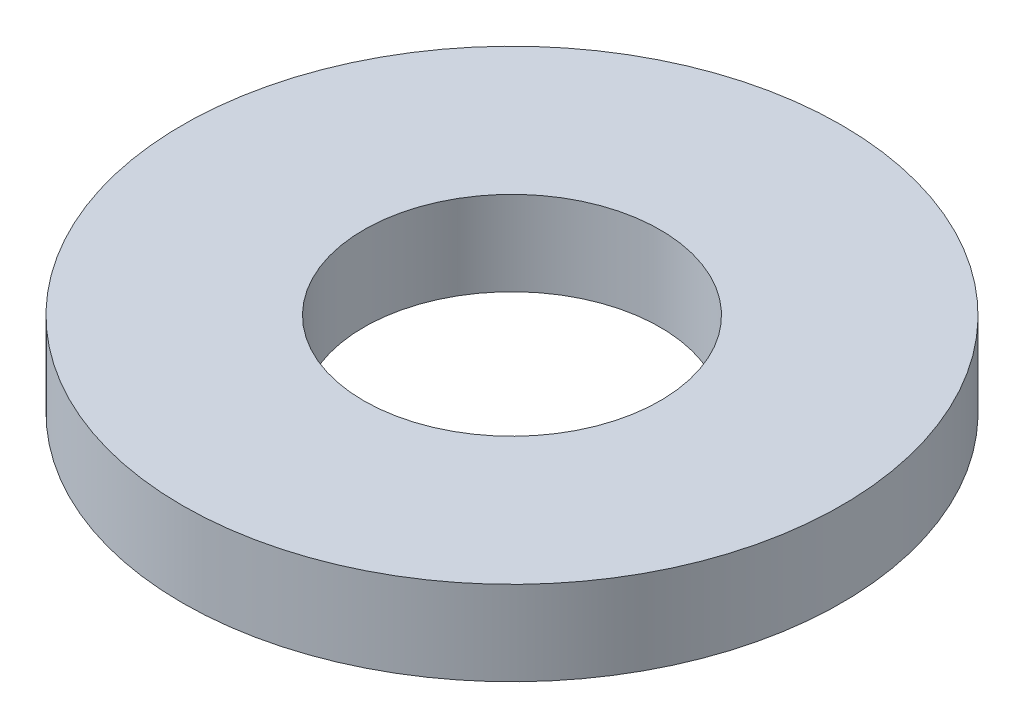
ISO-10303-21;
HEADER;
FILE_DESCRIPTION(('STEP AP214'),'2;1');
FILE_NAME('part.step','',(''),(''),'','','');
FILE_SCHEMA(('AUTOMOTIVE_DESIGN { 1 0 10303 214 1 1 1 1 }'));
ENDSEC;
DATA;
#1=APPLICATION_CONTEXT('core data for automotive mechanical design processes');
#2=APPLICATION_PROTOCOL_DEFINITION('international standard','automotive_design',2000,#1);
#3=PRODUCT_CONTEXT('',#1,'mechanical');
#4=PRODUCT('Part','Part','',(#3));
#5=PRODUCT_RELATED_PRODUCT_CATEGORY('part','',(#4));
#6=PRODUCT_DEFINITION_FORMATION('','',#4);
#7=PRODUCT_DEFINITION_CONTEXT('part definition',#1,'design');
#8=PRODUCT_DEFINITION('design','',#6,#7);
#9=PRODUCT_DEFINITION_SHAPE('','',#8);
#10=(LENGTH_UNIT() NAMED_UNIT(*) SI_UNIT(.MILLI.,.METRE.));
#11=(NAMED_UNIT(*) PLANE_ANGLE_UNIT() SI_UNIT($,.RADIAN.));
#12=(NAMED_UNIT(*) SI_UNIT($,.STERADIAN.) SOLID_ANGLE_UNIT());
#13=UNCERTAINTY_MEASURE_WITH_UNIT(LENGTH_MEASURE(1.E-05),#10,'distance_accuracy_value','');
#14=(GEOMETRIC_REPRESENTATION_CONTEXT(3) GLOBAL_UNCERTAINTY_ASSIGNED_CONTEXT((#13)) GLOBAL_UNIT_ASSIGNED_CONTEXT((#10,
#11,#12)) REPRESENTATION_CONTEXT('',''));
#15=CARTESIAN_POINT('',(0.,0.,0.));
#16=DIRECTION('',(0.,0.,1.));
#17=DIRECTION('',(1.,0.,0.));
#18=AXIS2_PLACEMENT_3D('',#15,#16,#17);
#19=CARTESIAN_POINT('',(0.,2.032,0.));
#20=DIRECTION('',(0.,-1.,0.));
#21=DIRECTION('',(0.,0.,-1.));
#22=AXIS2_PLACEMENT_3D('',#19,#20,#21);
#23=CYLINDRICAL_SURFACE('',#22,7.9375);
#24=CARTESIAN_POINT('',(0.,2.032,0.));
#25=DIRECTION('',(0.,1.,0.));
#26=DIRECTION('',(0.,0.,1.));
#27=AXIS2_PLACEMENT_3D('',#24,#25,#26);
#28=CIRCLE('',#27,7.9375);
#29=CARTESIAN_POINT('',(0.,2.032,7.9375));
#30=VERTEX_POINT('',#29);
#31=EDGE_CURVE('E10',#30,#30,#28,.T.);
#32=ORIENTED_EDGE('',*,*,#31,.F.);
#33=EDGE_LOOP('',(#32));
#34=FACE_BOUND('',#33,.T.);
#35=CARTESIAN_POINT('',(0.,0.,0.));
#36=DIRECTION('',(0.,1.,0.));
#37=DIRECTION('',(0.,0.,1.));
#38=AXIS2_PLACEMENT_3D('',#35,#36,#37);
#39=CIRCLE('',#38,7.9375);
#40=CARTESIAN_POINT('',(0.,0.,7.9375));
#41=VERTEX_POINT('',#40);
#42=EDGE_CURVE('E42',#41,#41,#39,.T.);
#43=ORIENTED_EDGE('',*,*,#42,.T.);
#44=EDGE_LOOP('',(#43));
#45=FACE_BOUND('',#44,.T.);
#46=ADVANCED_FACE('F39',(#34,#45),#23,.T.);
#47=CARTESIAN_POINT('',(0.,2.032,0.));
#48=DIRECTION('',(0.,1.,0.));
#49=DIRECTION('',(0.,0.,1.));
#50=AXIS2_PLACEMENT_3D('',#47,#48,#49);
#51=PLANE('',#50);
#52=CARTESIAN_POINT('',(0.,2.032,0.));
#53=DIRECTION('',(0.,1.,0.));
#54=DIRECTION('',(0.,0.,1.));
#55=AXIS2_PLACEMENT_3D('',#52,#53,#54);
#56=CIRCLE('',#55,3.5687);
#57=CARTESIAN_POINT('',(0.,2.032,3.5687));
#58=VERTEX_POINT('',#57);
#59=EDGE_CURVE('E51',#58,#58,#56,.T.);
#60=ORIENTED_EDGE('',*,*,#59,.F.);
#61=EDGE_LOOP('',(#60));
#62=FACE_BOUND('',#61,.T.);
#63=ORIENTED_EDGE('',*,*,#31,.T.);
#64=EDGE_LOOP('',(#63));
#65=FACE_BOUND('',#64,.T.);
#66=ADVANCED_FACE('F66',(#62,#65),#51,.T.);
#67=CARTESIAN_POINT('',(0.,0.,0.));
#68=DIRECTION('',(0.,1.,0.));
#69=DIRECTION('',(0.,0.,1.));
#70=AXIS2_PLACEMENT_3D('',#67,#68,#69);
#71=PLANE('',#70);
#72=CARTESIAN_POINT('',(0.,0.,0.));
#73=DIRECTION('',(0.,1.,0.));
#74=DIRECTION('',(0.,0.,1.));
#75=AXIS2_PLACEMENT_3D('',#72,#73,#74);
#76=CIRCLE('',#75,3.5687);
#77=CARTESIAN_POINT('',(0.,0.,3.5687));
#78=VERTEX_POINT('',#77);
#79=EDGE_CURVE('E49',#78,#78,#76,.T.);
#80=ORIENTED_EDGE('',*,*,#79,.T.);
#81=EDGE_LOOP('',(#80));
#82=FACE_BOUND('',#81,.T.);
#83=ORIENTED_EDGE('',*,*,#42,.F.);
#84=EDGE_LOOP('',(#83));
#85=FACE_BOUND('',#84,.T.);
#86=ADVANCED_FACE('F57',(#82,#85),#71,.F.);
#87=CARTESIAN_POINT('',(0.,0.,0.));
#88=DIRECTION('',(0.,1.,0.));
#89=DIRECTION('',(0.,0.,1.));
#90=AXIS2_PLACEMENT_3D('',#87,#88,#89);
#91=CYLINDRICAL_SURFACE('',#90,3.5687);
#92=ORIENTED_EDGE('',*,*,#79,.F.);
#93=EDGE_LOOP('',(#92));
#94=FACE_BOUND('',#93,.T.);
#95=ORIENTED_EDGE('',*,*,#59,.T.);
#96=EDGE_LOOP('',(#95));
#97=FACE_BOUND('',#96,.T.);
#98=ADVANCED_FACE('F60',(#94,#97),#91,.F.);
#99=CLOSED_SHELL('',(#46,#66,#86,#98));
#100=MANIFOLD_SOLID_BREP('B2',#99);
#101=ADVANCED_BREP_SHAPE_REPRESENTATION('',(#18,#100),#14);
#102=SHAPE_DEFINITION_REPRESENTATION(#9,#101);
ENDSEC;
END-ISO-10303-21;
